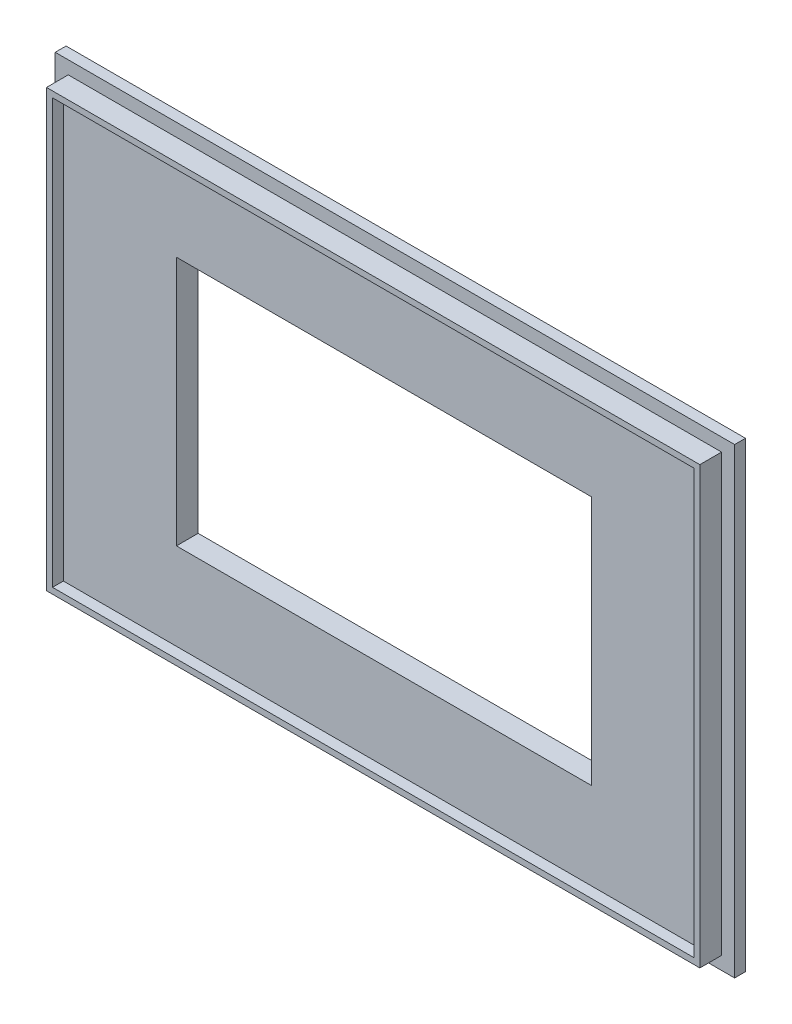
ISO-10303-21;
HEADER;
FILE_DESCRIPTION(('STEP AP214'),'2;1');
FILE_NAME('part.step','',(''),(''),'','','');
FILE_SCHEMA(('AUTOMOTIVE_DESIGN { 1 0 10303 214 1 1 1 1 }'));
ENDSEC;
DATA;
#1=APPLICATION_CONTEXT('core data for automotive mechanical design processes');
#2=APPLICATION_PROTOCOL_DEFINITION('international standard','automotive_design',2000,#1);
#3=PRODUCT_CONTEXT('',#1,'mechanical');
#4=PRODUCT('Part','Part','',(#3));
#5=PRODUCT_RELATED_PRODUCT_CATEGORY('part','',(#4));
#6=PRODUCT_DEFINITION_FORMATION('','',#4);
#7=PRODUCT_DEFINITION_CONTEXT('part definition',#1,'design');
#8=PRODUCT_DEFINITION('design','',#6,#7);
#9=PRODUCT_DEFINITION_SHAPE('','',#8);
#10=(LENGTH_UNIT() NAMED_UNIT(*) SI_UNIT(.MILLI.,.METRE.));
#11=(NAMED_UNIT(*) PLANE_ANGLE_UNIT() SI_UNIT($,.RADIAN.));
#12=(NAMED_UNIT(*) SI_UNIT($,.STERADIAN.) SOLID_ANGLE_UNIT());
#13=UNCERTAINTY_MEASURE_WITH_UNIT(LENGTH_MEASURE(1.E-05),#10,'distance_accuracy_value','');
#14=(GEOMETRIC_REPRESENTATION_CONTEXT(3) GLOBAL_UNCERTAINTY_ASSIGNED_CONTEXT((#13)) GLOBAL_UNIT_ASSIGNED_CONTEXT((#10,
#11,#12)) REPRESENTATION_CONTEXT('',''));
#15=CARTESIAN_POINT('',(0.,0.,0.));
#16=DIRECTION('',(0.,0.,1.));
#17=DIRECTION('',(1.,0.,0.));
#18=AXIS2_PLACEMENT_3D('',#15,#16,#17);
#19=CARTESIAN_POINT('',(0.,0.,5.08));
#20=DIRECTION('',(0.,0.,-1.));
#21=DIRECTION('',(-1.,0.,0.));
#22=AXIS2_PLACEMENT_3D('',#19,#20,#21);
#23=PLANE('',#22);
#24=DIRECTION('',(0.,1.,0.));
#25=VECTOR('',#24,1.);
#26=CARTESIAN_POINT('',(74.93,-49.53,5.08));
#27=LINE('',#26,#25);
#28=CARTESIAN_POINT('',(74.93,-49.53,5.08));
#29=VERTEX_POINT('',#28);
#30=CARTESIAN_POINT('',(74.93,49.53,5.08));
#31=VERTEX_POINT('',#30);
#32=EDGE_CURVE('E190',#29,#31,#27,.T.);
#33=ORIENTED_EDGE('',*,*,#32,.T.);
#34=DIRECTION('',(-1.,0.,0.));
#35=VECTOR('',#34,1.);
#36=CARTESIAN_POINT('',(-74.93,49.53,5.08));
#37=LINE('',#36,#35);
#38=CARTESIAN_POINT('',(-74.93,49.53,5.08));
#39=VERTEX_POINT('',#38);
#40=EDGE_CURVE('E193',#31,#39,#37,.T.);
#41=ORIENTED_EDGE('',*,*,#40,.T.);
#42=DIRECTION('',(0.,-1.,0.));
#43=VECTOR('',#42,1.);
#44=CARTESIAN_POINT('',(-74.93,-49.53,5.08));
#45=LINE('',#44,#43);
#46=CARTESIAN_POINT('',(-74.93,-49.53,5.08));
#47=VERTEX_POINT('',#46);
#48=EDGE_CURVE('E197',#39,#47,#45,.T.);
#49=ORIENTED_EDGE('',*,*,#48,.T.);
#50=DIRECTION('',(1.,0.,0.));
#51=VECTOR('',#50,1.);
#52=CARTESIAN_POINT('',(-74.93,-49.53,5.08));
#53=LINE('',#52,#51);
#54=EDGE_CURVE('E200',#47,#29,#53,.T.);
#55=ORIENTED_EDGE('',*,*,#54,.T.);
#56=EDGE_LOOP('',(#33,#41,#49,#55));
#57=FACE_BOUND('',#56,.T.);
#58=DIRECTION('',(0.,1.,0.));
#59=VECTOR('',#58,1.);
#60=CARTESIAN_POINT('',(48.514,-29.21,5.08));
#61=LINE('',#60,#59);
#62=CARTESIAN_POINT('',(48.514,-29.21,5.08));
#63=VERTEX_POINT('',#62);
#64=CARTESIAN_POINT('',(48.514,29.21,5.08));
#65=VERTEX_POINT('',#64);
#66=EDGE_CURVE('E158',#63,#65,#61,.T.);
#67=ORIENTED_EDGE('',*,*,#66,.F.);
#68=DIRECTION('',(1.,0.,0.));
#69=VECTOR('',#68,1.);
#70=CARTESIAN_POINT('',(-48.514,-29.21,5.08));
#71=LINE('',#70,#69);
#72=CARTESIAN_POINT('',(-48.514,-29.21,5.08));
#73=VERTEX_POINT('',#72);
#74=EDGE_CURVE('E173',#73,#63,#71,.T.);
#75=ORIENTED_EDGE('',*,*,#74,.F.);
#76=DIRECTION('',(0.,-1.,0.));
#77=VECTOR('',#76,1.);
#78=CARTESIAN_POINT('',(-48.514,-29.21,5.08));
#79=LINE('',#78,#77);
#80=CARTESIAN_POINT('',(-48.514,29.21,5.08));
#81=VERTEX_POINT('',#80);
#82=EDGE_CURVE('E54',#81,#73,#79,.T.);
#83=ORIENTED_EDGE('',*,*,#82,.F.);
#84=DIRECTION('',(-1.,0.,0.));
#85=VECTOR('',#84,1.);
#86=CARTESIAN_POINT('',(-48.514,29.21,5.08));
#87=LINE('',#86,#85);
#88=EDGE_CURVE('E181',#65,#81,#87,.T.);
#89=ORIENTED_EDGE('',*,*,#88,.F.);
#90=EDGE_LOOP('',(#67,#75,#83,#89));
#91=FACE_BOUND('',#90,.T.);
#92=ADVANCED_FACE('F39',(#57,#91),#23,.F.);
#93=CARTESIAN_POINT('',(79.375,-53.975,2.54));
#94=DIRECTION('',(-1.,0.,0.));
#95=DIRECTION('',(0.,0.,1.));
#96=AXIS2_PLACEMENT_3D('',#93,#94,#95);
#97=PLANE('',#96);
#98=DIRECTION('',(0.,1.,0.));
#99=VECTOR('',#98,1.);
#100=CARTESIAN_POINT('',(79.375,-53.975,0.));
#101=LINE('',#100,#99);
#102=CARTESIAN_POINT('',(79.375,-53.975,0.));
#103=VERTEX_POINT('',#102);
#104=CARTESIAN_POINT('',(79.375,53.975,0.));
#105=VERTEX_POINT('',#104);
#106=EDGE_CURVE('E246',#103,#105,#101,.T.);
#107=ORIENTED_EDGE('',*,*,#106,.T.);
#108=DIRECTION('',(0.,0.,-1.));
#109=VECTOR('',#108,1.);
#110=CARTESIAN_POINT('',(79.375,53.975,2.54));
#111=LINE('',#110,#109);
#112=CARTESIAN_POINT('',(79.375,53.975,2.54));
#113=VERTEX_POINT('',#112);
#114=EDGE_CURVE('E11',#113,#105,#111,.T.);
#115=ORIENTED_EDGE('',*,*,#114,.F.);
#116=DIRECTION('',(0.,1.,0.));
#117=VECTOR('',#116,1.);
#118=CARTESIAN_POINT('',(79.375,-53.975,2.54));
#119=LINE('',#118,#117);
#120=CARTESIAN_POINT('',(79.375,-53.975,2.54));
#121=VERTEX_POINT('',#120);
#122=EDGE_CURVE('E253',#121,#113,#119,.T.);
#123=ORIENTED_EDGE('',*,*,#122,.F.);
#124=DIRECTION('',(0.,0.,-1.));
#125=VECTOR('',#124,1.);
#126=CARTESIAN_POINT('',(79.375,-53.975,2.54));
#127=LINE('',#126,#125);
#128=EDGE_CURVE('E263',#121,#103,#127,.T.);
#129=ORIENTED_EDGE('',*,*,#128,.T.);
#130=EDGE_LOOP('',(#107,#115,#123,#129));
#131=FACE_BOUND('',#130,.T.);
#132=ADVANCED_FACE('F41',(#131),#97,.F.);
#133=CARTESIAN_POINT('',(-79.375,53.975,2.54));
#134=DIRECTION('',(0.,-1.,0.));
#135=DIRECTION('',(0.,0.,-1.));
#136=AXIS2_PLACEMENT_3D('',#133,#134,#135);
#137=PLANE('',#136);
#138=DIRECTION('',(-1.,0.,0.));
#139=VECTOR('',#138,1.);
#140=CARTESIAN_POINT('',(-79.375,53.975,0.));
#141=LINE('',#140,#139);
#142=CARTESIAN_POINT('',(-79.375,53.975,0.));
#143=VERTEX_POINT('',#142);
#144=EDGE_CURVE('E266',#105,#143,#141,.T.);
#145=ORIENTED_EDGE('',*,*,#144,.T.);
#146=DIRECTION('',(0.,0.,-1.));
#147=VECTOR('',#146,1.);
#148=CARTESIAN_POINT('',(-79.375,53.975,2.54));
#149=LINE('',#148,#147);
#150=CARTESIAN_POINT('',(-79.375,53.975,2.54));
#151=VERTEX_POINT('',#150);
#152=EDGE_CURVE('E47',#151,#143,#149,.T.);
#153=ORIENTED_EDGE('',*,*,#152,.F.);
#154=DIRECTION('',(-1.,0.,0.));
#155=VECTOR('',#154,1.);
#156=CARTESIAN_POINT('',(-79.375,53.975,2.54));
#157=LINE('',#156,#155);
#158=EDGE_CURVE('E256',#113,#151,#157,.T.);
#159=ORIENTED_EDGE('',*,*,#158,.F.);
#160=ORIENTED_EDGE('',*,*,#114,.T.);
#161=EDGE_LOOP('',(#145,#153,#159,#160));
#162=FACE_BOUND('',#161,.T.);
#163=ADVANCED_FACE('F294',(#162),#137,.F.);
#164=CARTESIAN_POINT('',(-79.375,-53.975,2.54));
#165=DIRECTION('',(1.,0.,0.));
#166=DIRECTION('',(0.,0.,-1.));
#167=AXIS2_PLACEMENT_3D('',#164,#165,#166);
#168=PLANE('',#167);
#169=DIRECTION('',(0.,-1.,0.));
#170=VECTOR('',#169,1.);
#171=CARTESIAN_POINT('',(-79.375,-53.975,0.));
#172=LINE('',#171,#170);
#173=CARTESIAN_POINT('',(-79.375,-53.975,0.));
#174=VERTEX_POINT('',#173);
#175=EDGE_CURVE('E268',#143,#174,#172,.T.);
#176=ORIENTED_EDGE('',*,*,#175,.T.);
#177=DIRECTION('',(0.,0.,-1.));
#178=VECTOR('',#177,1.);
#179=CARTESIAN_POINT('',(-79.375,-53.975,2.54));
#180=LINE('',#179,#178);
#181=CARTESIAN_POINT('',(-79.375,-53.975,2.54));
#182=VERTEX_POINT('',#181);
#183=EDGE_CURVE('E273',#182,#174,#180,.T.);
#184=ORIENTED_EDGE('',*,*,#183,.F.);
#185=DIRECTION('',(0.,-1.,0.));
#186=VECTOR('',#185,1.);
#187=CARTESIAN_POINT('',(-79.375,-53.975,2.54));
#188=LINE('',#187,#186);
#189=EDGE_CURVE('E259',#151,#182,#188,.T.);
#190=ORIENTED_EDGE('',*,*,#189,.F.);
#191=ORIENTED_EDGE('',*,*,#152,.T.);
#192=EDGE_LOOP('',(#176,#184,#190,#191));
#193=FACE_BOUND('',#192,.T.);
#194=ADVANCED_FACE('F280',(#193),#168,.F.);
#195=CARTESIAN_POINT('',(-79.375,-53.975,2.54));
#196=DIRECTION('',(0.,1.,0.));
#197=DIRECTION('',(0.,0.,1.));
#198=AXIS2_PLACEMENT_3D('',#195,#196,#197);
#199=PLANE('',#198);
#200=DIRECTION('',(1.,0.,0.));
#201=VECTOR('',#200,1.);
#202=CARTESIAN_POINT('',(-79.375,-53.975,0.));
#203=LINE('',#202,#201);
#204=EDGE_CURVE('E257',#174,#103,#203,.T.);
#205=ORIENTED_EDGE('',*,*,#204,.T.);
#206=ORIENTED_EDGE('',*,*,#128,.F.);
#207=DIRECTION('',(1.,0.,0.));
#208=VECTOR('',#207,1.);
#209=CARTESIAN_POINT('',(-79.375,-53.975,2.54));
#210=LINE('',#209,#208);
#211=EDGE_CURVE('E261',#182,#121,#210,.T.);
#212=ORIENTED_EDGE('',*,*,#211,.F.);
#213=ORIENTED_EDGE('',*,*,#183,.T.);
#214=EDGE_LOOP('',(#205,#206,#212,#213));
#215=FACE_BOUND('',#214,.T.);
#216=ADVANCED_FACE('F287',(#215),#199,.F.);
#217=CARTESIAN_POINT('',(0.,0.,2.54));
#218=DIRECTION('',(0.,0.,-1.));
#219=DIRECTION('',(-1.,0.,0.));
#220=AXIS2_PLACEMENT_3D('',#217,#218,#219);
#221=PLANE('',#220);
#222=DIRECTION('',(0.,1.,0.));
#223=VECTOR('',#222,1.);
#224=CARTESIAN_POINT('',(-76.327,-50.927,2.54));
#225=LINE('',#224,#223);
#226=CARTESIAN_POINT('',(-76.327,-50.927,2.54));
#227=VERTEX_POINT('',#226);
#228=CARTESIAN_POINT('',(-76.327,50.927,2.54));
#229=VERTEX_POINT('',#228);
#230=EDGE_CURVE('E226',#227,#229,#225,.T.);
#231=ORIENTED_EDGE('',*,*,#230,.T.);
#232=DIRECTION('',(1.,0.,0.));
#233=VECTOR('',#232,1.);
#234=CARTESIAN_POINT('',(-76.327,50.927,2.54));
#235=LINE('',#234,#233);
#236=CARTESIAN_POINT('',(76.327,50.927,2.54));
#237=VERTEX_POINT('',#236);
#238=EDGE_CURVE('E215',#229,#237,#235,.T.);
#239=ORIENTED_EDGE('',*,*,#238,.T.);
#240=DIRECTION('',(0.,1.,0.));
#241=VECTOR('',#240,1.);
#242=CARTESIAN_POINT('',(76.327,-50.927,2.54));
#243=LINE('',#242,#241);
#244=CARTESIAN_POINT('',(76.327,-50.927,2.54));
#245=VERTEX_POINT('',#244);
#246=EDGE_CURVE('E236',#245,#237,#243,.T.);
#247=ORIENTED_EDGE('',*,*,#246,.F.);
#248=DIRECTION('',(1.,0.,0.));
#249=VECTOR('',#248,1.);
#250=CARTESIAN_POINT('',(-76.327,-50.927,2.54));
#251=LINE('',#250,#249);
#252=EDGE_CURVE('E239',#227,#245,#251,.T.);
#253=ORIENTED_EDGE('',*,*,#252,.F.);
#254=EDGE_LOOP('',(#231,#239,#247,#253));
#255=FACE_BOUND('',#254,.T.);
#256=ORIENTED_EDGE('',*,*,#122,.T.);
#257=ORIENTED_EDGE('',*,*,#158,.T.);
#258=ORIENTED_EDGE('',*,*,#189,.T.);
#259=ORIENTED_EDGE('',*,*,#211,.T.);
#260=EDGE_LOOP('',(#256,#257,#258,#259));
#261=FACE_BOUND('',#260,.T.);
#262=ADVANCED_FACE('F293',(#255,#261),#221,.F.);
#263=CARTESIAN_POINT('',(0.,0.,0.));
#264=DIRECTION('',(0.,0.,-1.));
#265=DIRECTION('',(-1.,0.,0.));
#266=AXIS2_PLACEMENT_3D('',#263,#264,#265);
#267=PLANE('',#266);
#268=DIRECTION('',(0.,1.,0.));
#269=VECTOR('',#268,1.);
#270=CARTESIAN_POINT('',(48.514,-29.21,0.));
#271=LINE('',#270,#269);
#272=CARTESIAN_POINT('',(48.514,-29.21,0.));
#273=VERTEX_POINT('',#272);
#274=CARTESIAN_POINT('',(48.514,29.21,0.));
#275=VERTEX_POINT('',#274);
#276=EDGE_CURVE('E155',#273,#275,#271,.T.);
#277=ORIENTED_EDGE('',*,*,#276,.T.);
#278=DIRECTION('',(-1.,0.,0.));
#279=VECTOR('',#278,1.);
#280=CARTESIAN_POINT('',(-48.514,29.21,0.));
#281=LINE('',#280,#279);
#282=CARTESIAN_POINT('',(-48.514,29.21,0.));
#283=VERTEX_POINT('',#282);
#284=EDGE_CURVE('E166',#275,#283,#281,.T.);
#285=ORIENTED_EDGE('',*,*,#284,.T.);
#286=DIRECTION('',(0.,-1.,0.));
#287=VECTOR('',#286,1.);
#288=CARTESIAN_POINT('',(-48.514,-29.21,0.));
#289=LINE('',#288,#287);
#290=CARTESIAN_POINT('',(-48.514,-29.21,0.));
#291=VERTEX_POINT('',#290);
#292=EDGE_CURVE('E59',#283,#291,#289,.T.);
#293=ORIENTED_EDGE('',*,*,#292,.T.);
#294=DIRECTION('',(1.,0.,0.));
#295=VECTOR('',#294,1.);
#296=CARTESIAN_POINT('',(-48.514,-29.21,0.));
#297=LINE('',#296,#295);
#298=EDGE_CURVE('E163',#291,#273,#297,.T.);
#299=ORIENTED_EDGE('',*,*,#298,.T.);
#300=EDGE_LOOP('',(#277,#285,#293,#299));
#301=FACE_BOUND('',#300,.T.);
#302=ORIENTED_EDGE('',*,*,#106,.F.);
#303=ORIENTED_EDGE('',*,*,#204,.F.);
#304=ORIENTED_EDGE('',*,*,#175,.F.);
#305=ORIENTED_EDGE('',*,*,#144,.F.);
#306=EDGE_LOOP('',(#302,#303,#304,#305));
#307=FACE_BOUND('',#306,.T.);
#308=ADVANCED_FACE('F170',(#301,#307),#267,.T.);
#309=CARTESIAN_POINT('',(-76.327,50.927,7.62));
#310=DIRECTION('',(0.,1.,0.));
#311=DIRECTION('',(0.,0.,1.));
#312=AXIS2_PLACEMENT_3D('',#309,#310,#311);
#313=PLANE('',#312);
#314=ORIENTED_EDGE('',*,*,#238,.F.);
#315=DIRECTION('',(0.,0.,-1.));
#316=VECTOR('',#315,1.);
#317=CARTESIAN_POINT('',(-76.327,50.927,7.62));
#318=LINE('',#317,#316);
#319=CARTESIAN_POINT('',(-76.327,50.927,7.62));
#320=VERTEX_POINT('',#319);
#321=EDGE_CURVE('E243',#320,#229,#318,.T.);
#322=ORIENTED_EDGE('',*,*,#321,.F.);
#323=DIRECTION('',(1.,0.,0.));
#324=VECTOR('',#323,1.);
#325=CARTESIAN_POINT('',(-76.327,50.927,7.62));
#326=LINE('',#325,#324);
#327=CARTESIAN_POINT('',(76.327,50.927,7.62));
#328=VERTEX_POINT('',#327);
#329=EDGE_CURVE('E222',#320,#328,#326,.T.);
#330=ORIENTED_EDGE('',*,*,#329,.T.);
#331=DIRECTION('',(0.,0.,-1.));
#332=VECTOR('',#331,1.);
#333=CARTESIAN_POINT('',(76.327,50.927,7.62));
#334=LINE('',#333,#332);
#335=EDGE_CURVE('E233',#328,#237,#334,.T.);
#336=ORIENTED_EDGE('',*,*,#335,.T.);
#337=EDGE_LOOP('',(#314,#322,#330,#336));
#338=FACE_BOUND('',#337,.T.);
#339=ADVANCED_FACE('F335',(#338),#313,.T.);
#340=CARTESIAN_POINT('',(-76.327,-50.927,7.62));
#341=DIRECTION('',(-1.,0.,0.));
#342=DIRECTION('',(0.,0.,1.));
#343=AXIS2_PLACEMENT_3D('',#340,#341,#342);
#344=PLANE('',#343);
#345=ORIENTED_EDGE('',*,*,#230,.F.);
#346=DIRECTION('',(0.,0.,-1.));
#347=VECTOR('',#346,1.);
#348=CARTESIAN_POINT('',(-76.327,-50.927,7.62));
#349=LINE('',#348,#347);
#350=CARTESIAN_POINT('',(-76.327,-50.927,7.62));
#351=VERTEX_POINT('',#350);
#352=EDGE_CURVE('E247',#351,#227,#349,.T.);
#353=ORIENTED_EDGE('',*,*,#352,.F.);
#354=DIRECTION('',(0.,1.,0.));
#355=VECTOR('',#354,1.);
#356=CARTESIAN_POINT('',(-76.327,-50.927,7.62));
#357=LINE('',#356,#355);
#358=EDGE_CURVE('E230',#351,#320,#357,.T.);
#359=ORIENTED_EDGE('',*,*,#358,.T.);
#360=ORIENTED_EDGE('',*,*,#321,.T.);
#361=EDGE_LOOP('',(#345,#353,#359,#360));
#362=FACE_BOUND('',#361,.T.);
#363=ADVANCED_FACE('F331',(#362),#344,.T.);
#364=CARTESIAN_POINT('',(-76.327,-50.927,7.62));
#365=DIRECTION('',(0.,1.,0.));
#366=DIRECTION('',(0.,0.,1.));
#367=AXIS2_PLACEMENT_3D('',#364,#365,#366);
#368=PLANE('',#367);
#369=ORIENTED_EDGE('',*,*,#252,.T.);
#370=DIRECTION('',(0.,0.,-1.));
#371=VECTOR('',#370,1.);
#372=CARTESIAN_POINT('',(76.327,-50.927,7.62));
#373=LINE('',#372,#371);
#374=CARTESIAN_POINT('',(76.327,-50.927,7.62));
#375=VERTEX_POINT('',#374);
#376=EDGE_CURVE('E249',#375,#245,#373,.T.);
#377=ORIENTED_EDGE('',*,*,#376,.F.);
#378=DIRECTION('',(1.,0.,0.));
#379=VECTOR('',#378,1.);
#380=CARTESIAN_POINT('',(-76.327,-50.927,7.62));
#381=LINE('',#380,#379);
#382=EDGE_CURVE('E228',#351,#375,#381,.T.);
#383=ORIENTED_EDGE('',*,*,#382,.F.);
#384=ORIENTED_EDGE('',*,*,#352,.T.);
#385=EDGE_LOOP('',(#369,#377,#383,#384));
#386=FACE_BOUND('',#385,.T.);
#387=ADVANCED_FACE('F334',(#386),#368,.F.);
#388=CARTESIAN_POINT('',(76.327,-50.927,7.62));
#389=DIRECTION('',(-1.,0.,0.));
#390=DIRECTION('',(0.,0.,1.));
#391=AXIS2_PLACEMENT_3D('',#388,#389,#390);
#392=PLANE('',#391);
#393=ORIENTED_EDGE('',*,*,#246,.T.);
#394=ORIENTED_EDGE('',*,*,#335,.F.);
#395=DIRECTION('',(0.,1.,0.));
#396=VECTOR('',#395,1.);
#397=CARTESIAN_POINT('',(76.327,-50.927,7.62));
#398=LINE('',#397,#396);
#399=EDGE_CURVE('E225',#375,#328,#398,.T.);
#400=ORIENTED_EDGE('',*,*,#399,.F.);
#401=ORIENTED_EDGE('',*,*,#376,.T.);
#402=EDGE_LOOP('',(#393,#394,#400,#401));
#403=FACE_BOUND('',#402,.T.);
#404=ADVANCED_FACE('F329',(#403),#392,.F.);
#405=CARTESIAN_POINT('',(0.,0.,7.62));
#406=DIRECTION('',(0.,0.,1.));
#407=DIRECTION('',(1.,0.,0.));
#408=AXIS2_PLACEMENT_3D('',#405,#406,#407);
#409=PLANE('',#408);
#410=DIRECTION('',(0.,1.,0.));
#411=VECTOR('',#410,1.);
#412=CARTESIAN_POINT('',(74.93,-49.53,7.62));
#413=LINE('',#412,#411);
#414=CARTESIAN_POINT('',(74.93,-49.53,7.62));
#415=VERTEX_POINT('',#414);
#416=CARTESIAN_POINT('',(74.93,49.53,7.62));
#417=VERTEX_POINT('',#416);
#418=EDGE_CURVE('E186',#415,#417,#413,.T.);
#419=ORIENTED_EDGE('',*,*,#418,.F.);
#420=DIRECTION('',(1.,0.,0.));
#421=VECTOR('',#420,1.);
#422=CARTESIAN_POINT('',(-74.93,-49.53,7.62));
#423=LINE('',#422,#421);
#424=CARTESIAN_POINT('',(-74.93,-49.53,7.62));
#425=VERTEX_POINT('',#424);
#426=EDGE_CURVE('E194',#425,#415,#423,.T.);
#427=ORIENTED_EDGE('',*,*,#426,.F.);
#428=DIRECTION('',(0.,-1.,0.));
#429=VECTOR('',#428,1.);
#430=CARTESIAN_POINT('',(-74.93,-49.53,7.62));
#431=LINE('',#430,#429);
#432=CARTESIAN_POINT('',(-74.93,49.53,7.62));
#433=VERTEX_POINT('',#432);
#434=EDGE_CURVE('E208',#433,#425,#431,.T.);
#435=ORIENTED_EDGE('',*,*,#434,.F.);
#436=DIRECTION('',(-1.,0.,0.));
#437=VECTOR('',#436,1.);
#438=CARTESIAN_POINT('',(-74.93,49.53,7.62));
#439=LINE('',#438,#437);
#440=EDGE_CURVE('E205',#417,#433,#439,.T.);
#441=ORIENTED_EDGE('',*,*,#440,.F.);
#442=EDGE_LOOP('',(#419,#427,#435,#441));
#443=FACE_BOUND('',#442,.T.);
#444=ORIENTED_EDGE('',*,*,#329,.F.);
#445=ORIENTED_EDGE('',*,*,#358,.F.);
#446=ORIENTED_EDGE('',*,*,#382,.T.);
#447=ORIENTED_EDGE('',*,*,#399,.T.);
#448=EDGE_LOOP('',(#444,#445,#446,#447));
#449=FACE_BOUND('',#448,.T.);
#450=ADVANCED_FACE('F325',(#443,#449),#409,.T.);
#451=CARTESIAN_POINT('',(74.93,-49.53,5.08));
#452=DIRECTION('',(1.,0.,0.));
#453=DIRECTION('',(0.,0.,-1.));
#454=AXIS2_PLACEMENT_3D('',#451,#452,#453);
#455=PLANE('',#454);
#456=ORIENTED_EDGE('',*,*,#418,.T.);
#457=DIRECTION('',(0.,0.,1.));
#458=VECTOR('',#457,1.);
#459=CARTESIAN_POINT('',(74.93,49.53,5.08));
#460=LINE('',#459,#458);
#461=EDGE_CURVE('E203',#31,#417,#460,.T.);
#462=ORIENTED_EDGE('',*,*,#461,.F.);
#463=ORIENTED_EDGE('',*,*,#32,.F.);
#464=DIRECTION('',(0.,0.,1.));
#465=VECTOR('',#464,1.);
#466=CARTESIAN_POINT('',(74.93,-49.53,5.08));
#467=LINE('',#466,#465);
#468=EDGE_CURVE('E213',#29,#415,#467,.T.);
#469=ORIENTED_EDGE('',*,*,#468,.T.);
#470=EDGE_LOOP('',(#456,#462,#463,#469));
#471=FACE_BOUND('',#470,.T.);
#472=ADVANCED_FACE('F314',(#471),#455,.F.);
#473=CARTESIAN_POINT('',(-74.93,-49.53,5.08));
#474=DIRECTION('',(0.,-1.,0.));
#475=DIRECTION('',(0.,0.,-1.));
#476=AXIS2_PLACEMENT_3D('',#473,#474,#475);
#477=PLANE('',#476);
#478=ORIENTED_EDGE('',*,*,#426,.T.);
#479=ORIENTED_EDGE('',*,*,#468,.F.);
#480=ORIENTED_EDGE('',*,*,#54,.F.);
#481=DIRECTION('',(0.,0.,1.));
#482=VECTOR('',#481,1.);
#483=CARTESIAN_POINT('',(-74.93,-49.53,5.08));
#484=LINE('',#483,#482);
#485=EDGE_CURVE('E216',#47,#425,#484,.T.);
#486=ORIENTED_EDGE('',*,*,#485,.T.);
#487=EDGE_LOOP('',(#478,#479,#480,#486));
#488=FACE_BOUND('',#487,.T.);
#489=ADVANCED_FACE('F310',(#488),#477,.F.);
#490=CARTESIAN_POINT('',(-74.93,-49.53,5.08));
#491=DIRECTION('',(-1.,0.,0.));
#492=DIRECTION('',(0.,0.,1.));
#493=AXIS2_PLACEMENT_3D('',#490,#491,#492);
#494=PLANE('',#493);
#495=ORIENTED_EDGE('',*,*,#434,.T.);
#496=ORIENTED_EDGE('',*,*,#485,.F.);
#497=ORIENTED_EDGE('',*,*,#48,.F.);
#498=DIRECTION('',(0.,0.,1.));
#499=VECTOR('',#498,1.);
#500=CARTESIAN_POINT('',(-74.93,49.53,5.08));
#501=LINE('',#500,#499);
#502=EDGE_CURVE('E218',#39,#433,#501,.T.);
#503=ORIENTED_EDGE('',*,*,#502,.T.);
#504=EDGE_LOOP('',(#495,#496,#497,#503));
#505=FACE_BOUND('',#504,.T.);
#506=ADVANCED_FACE('F313',(#505),#494,.F.);
#507=CARTESIAN_POINT('',(-74.93,49.53,5.08));
#508=DIRECTION('',(0.,1.,0.));
#509=DIRECTION('',(0.,0.,1.));
#510=AXIS2_PLACEMENT_3D('',#507,#508,#509);
#511=PLANE('',#510);
#512=ORIENTED_EDGE('',*,*,#440,.T.);
#513=ORIENTED_EDGE('',*,*,#502,.F.);
#514=ORIENTED_EDGE('',*,*,#40,.F.);
#515=ORIENTED_EDGE('',*,*,#461,.T.);
#516=EDGE_LOOP('',(#512,#513,#514,#515));
#517=FACE_BOUND('',#516,.T.);
#518=ADVANCED_FACE('F318',(#517),#511,.F.);
#519=CARTESIAN_POINT('',(48.514,-29.21,0.));
#520=DIRECTION('',(1.,0.,0.));
#521=DIRECTION('',(0.,0.,-1.));
#522=AXIS2_PLACEMENT_3D('',#519,#520,#521);
#523=PLANE('',#522);
#524=ORIENTED_EDGE('',*,*,#66,.T.);
#525=DIRECTION('',(0.,0.,1.));
#526=VECTOR('',#525,1.);
#527=CARTESIAN_POINT('',(48.514,29.21,0.));
#528=LINE('',#527,#526);
#529=EDGE_CURVE('E151',#275,#65,#528,.T.);
#530=ORIENTED_EDGE('',*,*,#529,.F.);
#531=ORIENTED_EDGE('',*,*,#276,.F.);
#532=DIRECTION('',(0.,0.,1.));
#533=VECTOR('',#532,1.);
#534=CARTESIAN_POINT('',(48.514,-29.21,0.));
#535=LINE('',#534,#533);
#536=EDGE_CURVE('E184',#273,#63,#535,.T.);
#537=ORIENTED_EDGE('',*,*,#536,.T.);
#538=EDGE_LOOP('',(#524,#530,#531,#537));
#539=FACE_BOUND('',#538,.T.);
#540=ADVANCED_FACE('F153',(#539),#523,.F.);
#541=CARTESIAN_POINT('',(-48.514,-29.21,0.));
#542=DIRECTION('',(0.,-1.,0.));
#543=DIRECTION('',(0.,0.,-1.));
#544=AXIS2_PLACEMENT_3D('',#541,#542,#543);
#545=PLANE('',#544);
#546=ORIENTED_EDGE('',*,*,#74,.T.);
#547=ORIENTED_EDGE('',*,*,#536,.F.);
#548=ORIENTED_EDGE('',*,*,#298,.F.);
#549=DIRECTION('',(0.,0.,1.));
#550=VECTOR('',#549,1.);
#551=CARTESIAN_POINT('',(-48.514,-29.21,0.));
#552=LINE('',#551,#550);
#553=EDGE_CURVE('E187',#291,#73,#552,.T.);
#554=ORIENTED_EDGE('',*,*,#553,.T.);
#555=EDGE_LOOP('',(#546,#547,#548,#554));
#556=FACE_BOUND('',#555,.T.);
#557=ADVANCED_FACE('F406',(#556),#545,.F.);
#558=CARTESIAN_POINT('',(-48.514,-29.21,0.));
#559=DIRECTION('',(-1.,0.,0.));
#560=DIRECTION('',(0.,0.,1.));
#561=AXIS2_PLACEMENT_3D('',#558,#559,#560);
#562=PLANE('',#561);
#563=ORIENTED_EDGE('',*,*,#82,.T.);
#564=ORIENTED_EDGE('',*,*,#553,.F.);
#565=ORIENTED_EDGE('',*,*,#292,.F.);
#566=DIRECTION('',(0.,0.,1.));
#567=VECTOR('',#566,1.);
#568=CARTESIAN_POINT('',(-48.514,29.21,0.));
#569=LINE('',#568,#567);
#570=EDGE_CURVE('E162',#283,#81,#569,.T.);
#571=ORIENTED_EDGE('',*,*,#570,.T.);
#572=EDGE_LOOP('',(#563,#564,#565,#571));
#573=FACE_BOUND('',#572,.T.);
#574=ADVANCED_FACE('F412',(#573),#562,.F.);
#575=CARTESIAN_POINT('',(-48.514,29.21,0.));
#576=DIRECTION('',(0.,1.,0.));
#577=DIRECTION('',(0.,0.,1.));
#578=AXIS2_PLACEMENT_3D('',#575,#576,#577);
#579=PLANE('',#578);
#580=ORIENTED_EDGE('',*,*,#88,.T.);
#581=ORIENTED_EDGE('',*,*,#570,.F.);
#582=ORIENTED_EDGE('',*,*,#284,.F.);
#583=ORIENTED_EDGE('',*,*,#529,.T.);
#584=EDGE_LOOP('',(#580,#581,#582,#583));
#585=FACE_BOUND('',#584,.T.);
#586=ADVANCED_FACE('F167',(#585),#579,.F.);
#587=CLOSED_SHELL('',(#92,#132,#163,#194,#216,#262,#308,#339,#363,#387,#404,#450,#472,#489,#506,
#518,#540,#557,#574,#586));
#588=MANIFOLD_SOLID_BREP('B2',#587);
#589=ADVANCED_BREP_SHAPE_REPRESENTATION('',(#18,#588),#14);
#590=SHAPE_DEFINITION_REPRESENTATION(#9,#589);
ENDSEC;
END-ISO-10303-21;
